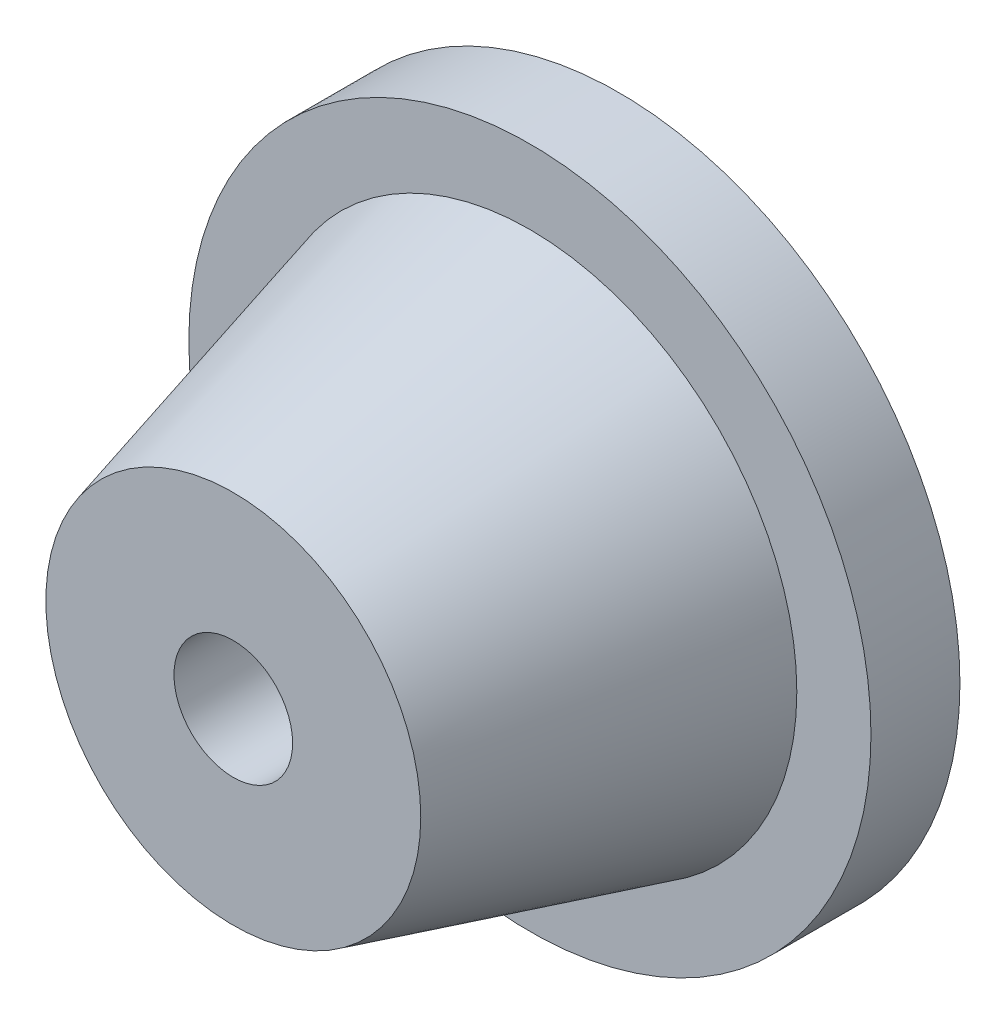
ISO-10303-21;
HEADER;
FILE_DESCRIPTION(('STEP AP214'),'2;1');
FILE_NAME('part.step','',(''),(''),'','','');
FILE_SCHEMA(('AUTOMOTIVE_DESIGN { 1 0 10303 214 1 1 1 1 }'));
ENDSEC;
DATA;
#1=APPLICATION_CONTEXT('core data for automotive mechanical design processes');
#2=APPLICATION_PROTOCOL_DEFINITION('international standard','automotive_design',2000,#1);
#3=PRODUCT_CONTEXT('',#1,'mechanical');
#4=PRODUCT('Part','Part','',(#3));
#5=PRODUCT_RELATED_PRODUCT_CATEGORY('part','',(#4));
#6=PRODUCT_DEFINITION_FORMATION('','',#4);
#7=PRODUCT_DEFINITION_CONTEXT('part definition',#1,'design');
#8=PRODUCT_DEFINITION('design','',#6,#7);
#9=PRODUCT_DEFINITION_SHAPE('','',#8);
#10=(LENGTH_UNIT() NAMED_UNIT(*) SI_UNIT(.MILLI.,.METRE.));
#11=(NAMED_UNIT(*) PLANE_ANGLE_UNIT() SI_UNIT($,.RADIAN.));
#12=(NAMED_UNIT(*) SI_UNIT($,.STERADIAN.) SOLID_ANGLE_UNIT());
#13=UNCERTAINTY_MEASURE_WITH_UNIT(LENGTH_MEASURE(1.E-05),#10,'distance_accuracy_value','');
#14=(GEOMETRIC_REPRESENTATION_CONTEXT(3) GLOBAL_UNCERTAINTY_ASSIGNED_CONTEXT((#13)) GLOBAL_UNIT_ASSIGNED_CONTEXT((#10,
#11,#12)) REPRESENTATION_CONTEXT('',''));
#15=CARTESIAN_POINT('',(0.,0.,0.));
#16=DIRECTION('',(0.,0.,1.));
#17=DIRECTION('',(1.,0.,0.));
#18=AXIS2_PLACEMENT_3D('',#15,#16,#17);
#19=CARTESIAN_POINT('',(0.,0.,3.));
#20=DIRECTION('',(0.,0.,-1.));
#21=DIRECTION('',(-1.,0.,0.));
#22=AXIS2_PLACEMENT_3D('',#19,#20,#21);
#23=CYLINDRICAL_SURFACE('',#22,11.5);
#24=CARTESIAN_POINT('',(0.,0.,3.));
#25=DIRECTION('',(0.,0.,1.));
#26=DIRECTION('',(1.,0.,0.));
#27=AXIS2_PLACEMENT_3D('',#24,#25,#26);
#28=CIRCLE('',#27,11.5);
#29=CARTESIAN_POINT('',(11.5,0.,3.));
#30=VERTEX_POINT('',#29);
#31=EDGE_CURVE('E51',#30,#30,#28,.T.);
#32=ORIENTED_EDGE('',*,*,#31,.F.);
#33=EDGE_LOOP('',(#32));
#34=FACE_BOUND('',#33,.T.);
#35=CARTESIAN_POINT('',(0.,0.,0.));
#36=DIRECTION('',(0.,0.,1.));
#37=DIRECTION('',(1.,0.,0.));
#38=AXIS2_PLACEMENT_3D('',#35,#36,#37);
#39=CIRCLE('',#38,11.5);
#40=CARTESIAN_POINT('',(11.5,0.,0.));
#41=VERTEX_POINT('',#40);
#42=EDGE_CURVE('E46',#41,#41,#39,.T.);
#43=ORIENTED_EDGE('',*,*,#42,.T.);
#44=EDGE_LOOP('',(#43));
#45=FACE_BOUND('',#44,.T.);
#46=ADVANCED_FACE('F43',(#34,#45),#23,.T.);
#47=CARTESIAN_POINT('',(0.,0.,3.));
#48=DIRECTION('',(0.,0.,1.));
#49=DIRECTION('',(1.,0.,0.));
#50=AXIS2_PLACEMENT_3D('',#47,#48,#49);
#51=PLANE('',#50);
#52=CARTESIAN_POINT('',(0.,0.,3.));
#53=DIRECTION('',(0.,0.,1.));
#54=DIRECTION('',(1.,0.,0.));
#55=AXIS2_PLACEMENT_3D('',#52,#53,#54);
#56=CIRCLE('',#55,9.);
#57=CARTESIAN_POINT('',(9.,0.,3.));
#58=VERTEX_POINT('',#57);
#59=EDGE_CURVE('E10',#58,#58,#56,.T.);
#60=ORIENTED_EDGE('',*,*,#59,.F.);
#61=EDGE_LOOP('',(#60));
#62=FACE_BOUND('',#61,.T.);
#63=ORIENTED_EDGE('',*,*,#31,.T.);
#64=EDGE_LOOP('',(#63));
#65=FACE_BOUND('',#64,.T.);
#66=ADVANCED_FACE('F94',(#62,#65),#51,.T.);
#67=CARTESIAN_POINT('',(0.,0.,0.));
#68=DIRECTION('',(0.,0.,1.));
#69=DIRECTION('',(1.,0.,0.));
#70=AXIS2_PLACEMENT_3D('',#67,#68,#69);
#71=PLANE('',#70);
#72=CARTESIAN_POINT('',(0.,0.,0.));
#73=DIRECTION('',(0.,0.,1.));
#74=DIRECTION('',(1.,0.,0.));
#75=AXIS2_PLACEMENT_3D('',#72,#73,#74);
#76=CIRCLE('',#75,2.);
#77=CARTESIAN_POINT('',(2.,0.,0.));
#78=VERTEX_POINT('',#77);
#79=EDGE_CURVE('E64',#78,#78,#76,.T.);
#80=ORIENTED_EDGE('',*,*,#79,.T.);
#81=EDGE_LOOP('',(#80));
#82=FACE_BOUND('',#81,.T.);
#83=ORIENTED_EDGE('',*,*,#42,.F.);
#84=EDGE_LOOP('',(#83));
#85=FACE_BOUND('',#84,.T.);
#86=ADVANCED_FACE('F90',(#82,#85),#71,.F.);
#87=CARTESIAN_POINT('',(0.,0.,3.));
#88=DIRECTION('',(0.,0.,-1.));
#89=DIRECTION('',(1.,0.,0.));
#90=AXIS2_PLACEMENT_3D('',#87,#88,#89);
#91=CONICAL_SURFACE('',#90,9.,0.26179938779915);
#92=CARTESIAN_POINT('',(0.,0.,13.));
#93=DIRECTION('',(0.,0.,1.));
#94=DIRECTION('',(1.,0.,0.));
#95=AXIS2_PLACEMENT_3D('',#92,#93,#94);
#96=CIRCLE('',#95,6.32050807568876);
#97=CARTESIAN_POINT('',(6.32050807568876,0.,13.));
#98=VERTEX_POINT('',#97);
#99=EDGE_CURVE('E61',#98,#98,#96,.T.);
#100=ORIENTED_EDGE('',*,*,#99,.F.);
#101=EDGE_LOOP('',(#100));
#102=FACE_BOUND('',#101,.T.);
#103=ORIENTED_EDGE('',*,*,#59,.T.);
#104=EDGE_LOOP('',(#103));
#105=FACE_BOUND('',#104,.T.);
#106=ADVANCED_FACE('F81',(#102,#105),#91,.T.);
#107=CARTESIAN_POINT('',(0.,0.,13.));
#108=DIRECTION('',(0.,0.,1.));
#109=DIRECTION('',(1.,0.,0.));
#110=AXIS2_PLACEMENT_3D('',#107,#108,#109);
#111=PLANE('',#110);
#112=CARTESIAN_POINT('',(0.,0.,13.));
#113=DIRECTION('',(0.,0.,1.));
#114=DIRECTION('',(1.,0.,0.));
#115=AXIS2_PLACEMENT_3D('',#112,#113,#114);
#116=CIRCLE('',#115,2.);
#117=CARTESIAN_POINT('',(2.,0.,13.));
#118=VERTEX_POINT('',#117);
#119=EDGE_CURVE('E59',#118,#118,#116,.T.);
#120=ORIENTED_EDGE('',*,*,#119,.F.);
#121=EDGE_LOOP('',(#120));
#122=FACE_BOUND('',#121,.T.);
#123=ORIENTED_EDGE('',*,*,#99,.T.);
#124=EDGE_LOOP('',(#123));
#125=FACE_BOUND('',#124,.T.);
#126=ADVANCED_FACE('F79',(#122,#125),#111,.T.);
#127=CARTESIAN_POINT('',(0.,0.,0.));
#128=DIRECTION('',(0.,0.,1.));
#129=DIRECTION('',(1.,0.,0.));
#130=AXIS2_PLACEMENT_3D('',#127,#128,#129);
#131=CYLINDRICAL_SURFACE('',#130,2.);
#132=ORIENTED_EDGE('',*,*,#79,.F.);
#133=EDGE_LOOP('',(#132));
#134=FACE_BOUND('',#133,.T.);
#135=ORIENTED_EDGE('',*,*,#119,.T.);
#136=EDGE_LOOP('',(#135));
#137=FACE_BOUND('',#136,.T.);
#138=ADVANCED_FACE('F77',(#134,#137),#131,.F.);
#139=CLOSED_SHELL('',(#46,#66,#86,#106,#126,#138));
#140=MANIFOLD_SOLID_BREP('B2',#139);
#141=ADVANCED_BREP_SHAPE_REPRESENTATION('',(#18,#140),#14);
#142=SHAPE_DEFINITION_REPRESENTATION(#9,#141);
ENDSEC;
END-ISO-10303-21;
